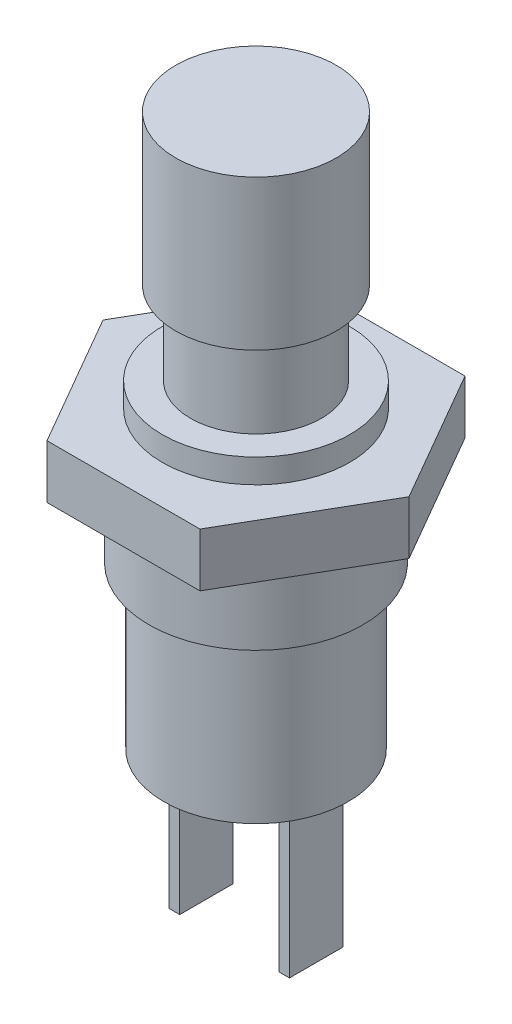
ISO-10303-21;
HEADER;
FILE_DESCRIPTION(('STEP AP214'),'2;1');
FILE_NAME('part.step','',(''),(''),'','','');
FILE_SCHEMA(('AUTOMOTIVE_DESIGN { 1 0 10303 214 1 1 1 1 }'));
ENDSEC;
DATA;
#1=APPLICATION_CONTEXT('core data for automotive mechanical design processes');
#2=APPLICATION_PROTOCOL_DEFINITION('international standard','automotive_design',2000,#1);
#3=PRODUCT_CONTEXT('',#1,'mechanical');
#4=PRODUCT('Part','Part','',(#3));
#5=PRODUCT_RELATED_PRODUCT_CATEGORY('part','',(#4));
#6=PRODUCT_DEFINITION_FORMATION('','',#4);
#7=PRODUCT_DEFINITION_CONTEXT('part definition',#1,'design');
#8=PRODUCT_DEFINITION('design','',#6,#7);
#9=PRODUCT_DEFINITION_SHAPE('','',#8);
#10=(LENGTH_UNIT() NAMED_UNIT(*) SI_UNIT(.MILLI.,.METRE.));
#11=(NAMED_UNIT(*) PLANE_ANGLE_UNIT() SI_UNIT($,.RADIAN.));
#12=(NAMED_UNIT(*) SI_UNIT($,.STERADIAN.) SOLID_ANGLE_UNIT());
#13=UNCERTAINTY_MEASURE_WITH_UNIT(LENGTH_MEASURE(1.E-05),#10,'distance_accuracy_value','');
#14=(GEOMETRIC_REPRESENTATION_CONTEXT(3) GLOBAL_UNCERTAINTY_ASSIGNED_CONTEXT((#13)) GLOBAL_UNIT_ASSIGNED_CONTEXT((#10,
#11,#12)) REPRESENTATION_CONTEXT('',''));
#15=CARTESIAN_POINT('',(0.,0.,0.));
#16=DIRECTION('',(0.,0.,1.));
#17=DIRECTION('',(1.,0.,0.));
#18=AXIS2_PLACEMENT_3D('',#15,#16,#17);
#19=CARTESIAN_POINT('',(3.44470505296126,0.,0.));
#20=DIRECTION('',(0.,1.,0.));
#21=DIRECTION('',(0.,0.,1.));
#22=AXIS2_PLACEMENT_3D('',#19,#20,#21);
#23=PLANE('',#22);
#24=DIRECTION('',(0.,0.,1.));
#25=VECTOR('',#24,1.);
#26=CARTESIAN_POINT('',(-1.85,0.,-1.));
#27=LINE('',#26,#25);
#28=CARTESIAN_POINT('',(-1.85,0.,-1.));
#29=VERTEX_POINT('',#28);
#30=CARTESIAN_POINT('',(-1.85,0.,0.999999999999998));
#31=VERTEX_POINT('',#30);
#32=EDGE_CURVE('E155',#29,#31,#27,.T.);
#33=ORIENTED_EDGE('',*,*,#32,.F.);
#34=DIRECTION('',(1.,0.,0.));
#35=VECTOR('',#34,1.);
#36=CARTESIAN_POINT('',(-2.25,0.,-1.));
#37=LINE('',#36,#35);
#38=CARTESIAN_POINT('',(-2.25,0.,-1.));
#39=VERTEX_POINT('',#38);
#40=EDGE_CURVE('E168',#39,#29,#37,.T.);
#41=ORIENTED_EDGE('',*,*,#40,.F.);
#42=DIRECTION('',(0.,0.,-1.));
#43=VECTOR('',#42,1.);
#44=CARTESIAN_POINT('',(-2.25,0.,-1.));
#45=LINE('',#44,#43);
#46=CARTESIAN_POINT('',(-2.25,0.,0.999999999999998));
#47=VERTEX_POINT('',#46);
#48=EDGE_CURVE('E177',#47,#39,#45,.T.);
#49=ORIENTED_EDGE('',*,*,#48,.F.);
#50=DIRECTION('',(-1.,0.,0.));
#51=VECTOR('',#50,1.);
#52=CARTESIAN_POINT('',(-2.25,0.,0.999999999999998));
#53=LINE('',#52,#51);
#54=EDGE_CURVE('E158',#31,#47,#53,.T.);
#55=ORIENTED_EDGE('',*,*,#54,.F.);
#56=EDGE_LOOP('',(#33,#41,#49,#55));
#57=FACE_BOUND('',#56,.T.);
#58=CARTESIAN_POINT('',(0.,0.,0.));
#59=DIRECTION('',(0.,1.,0.));
#60=DIRECTION('',(0.,0.,1.));
#61=AXIS2_PLACEMENT_3D('',#58,#59,#60);
#62=CIRCLE('',#61,3.44470505296126);
#63=CARTESIAN_POINT('',(0.,0.,3.44470505296126));
#64=VERTEX_POINT('',#63);
#65=EDGE_CURVE('E214',#64,#64,#62,.T.);
#66=ORIENTED_EDGE('',*,*,#65,.F.);
#67=EDGE_LOOP('',(#66));
#68=FACE_BOUND('',#67,.T.);
#69=DIRECTION('',(0.,0.,1.));
#70=VECTOR('',#69,1.);
#71=CARTESIAN_POINT('',(2.25,0.,-1.));
#72=LINE('',#71,#70);
#73=CARTESIAN_POINT('',(2.25,0.,-1.));
#74=VERTEX_POINT('',#73);
#75=CARTESIAN_POINT('',(2.25,0.,1.));
#76=VERTEX_POINT('',#75);
#77=EDGE_CURVE('E154',#74,#76,#72,.T.);
#78=ORIENTED_EDGE('',*,*,#77,.F.);
#79=DIRECTION('',(1.,0.,0.));
#80=VECTOR('',#79,1.);
#81=CARTESIAN_POINT('',(1.85,0.,-1.));
#82=LINE('',#81,#80);
#83=CARTESIAN_POINT('',(1.85,0.,-1.));
#84=VERTEX_POINT('',#83);
#85=EDGE_CURVE('E151',#84,#74,#82,.T.);
#86=ORIENTED_EDGE('',*,*,#85,.F.);
#87=DIRECTION('',(0.,0.,-1.));
#88=VECTOR('',#87,1.);
#89=CARTESIAN_POINT('',(1.85,0.,-1.));
#90=LINE('',#89,#88);
#91=CARTESIAN_POINT('',(1.85,0.,1.));
#92=VERTEX_POINT('',#91);
#93=EDGE_CURVE('E53',#92,#84,#90,.T.);
#94=ORIENTED_EDGE('',*,*,#93,.F.);
#95=DIRECTION('',(-1.,0.,0.));
#96=VECTOR('',#95,1.);
#97=CARTESIAN_POINT('',(1.85,0.,1.));
#98=LINE('',#97,#96);
#99=EDGE_CURVE('E48',#76,#92,#98,.T.);
#100=ORIENTED_EDGE('',*,*,#99,.F.);
#101=EDGE_LOOP('',(#78,#86,#94,#100));
#102=FACE_BOUND('',#101,.T.);
#103=ADVANCED_FACE('F33',(#57,#68,#102),#23,.F.);
#104=CARTESIAN_POINT('',(3.5,11.,0.));
#105=DIRECTION('',(0.,-1.,0.));
#106=DIRECTION('',(0.,0.,-1.));
#107=AXIS2_PLACEMENT_3D('',#104,#105,#106);
#108=PLANE('',#107);
#109=CARTESIAN_POINT('',(0.,11.,0.));
#110=DIRECTION('',(0.,1.,0.));
#111=DIRECTION('',(0.,0.,1.));
#112=AXIS2_PLACEMENT_3D('',#109,#110,#111);
#113=CIRCLE('',#112,3.5);
#114=CARTESIAN_POINT('',(0.,11.,3.5));
#115=VERTEX_POINT('',#114);
#116=EDGE_CURVE('E236',#115,#115,#113,.T.);
#117=ORIENTED_EDGE('',*,*,#116,.F.);
#118=EDGE_LOOP('',(#117));
#119=FACE_BOUND('',#118,.T.);
#120=DIRECTION('',(0.499999999999995,0.,-0.866025403784442));
#121=VECTOR('',#120,1.);
#122=CARTESIAN_POINT('',(2.85750000000006,11.,4.94933518262803));
#123=LINE('',#122,#121);
#124=CARTESIAN_POINT('',(2.85750000000006,11.,4.94933518262803));
#125=VERTEX_POINT('',#124);
#126=CARTESIAN_POINT('',(5.715,11.,0.));
#127=VERTEX_POINT('',#126);
#128=EDGE_CURVE('E193',#125,#127,#123,.T.);
#129=ORIENTED_EDGE('',*,*,#128,.T.);
#130=DIRECTION('',(-0.500000000000001,0.,-0.866025403784438));
#131=VECTOR('',#130,1.);
#132=CARTESIAN_POINT('',(5.715,11.,0.));
#133=LINE('',#132,#131);
#134=CARTESIAN_POINT('',(2.85749999999999,11.,-4.94933518262807));
#135=VERTEX_POINT('',#134);
#136=EDGE_CURVE('E196',#127,#135,#133,.T.);
#137=ORIENTED_EDGE('',*,*,#136,.T.);
#138=DIRECTION('',(-1.,0.,0.));
#139=VECTOR('',#138,1.);
#140=CARTESIAN_POINT('',(2.85749999999999,11.,-4.94933518262807));
#141=LINE('',#140,#139);
#142=CARTESIAN_POINT('',(-2.85750000000002,11.,-4.94933518262805));
#143=VERTEX_POINT('',#142);
#144=EDGE_CURVE('E199',#135,#143,#141,.T.);
#145=ORIENTED_EDGE('',*,*,#144,.T.);
#146=DIRECTION('',(-0.499999999999995,0.,0.866025403784441));
#147=VECTOR('',#146,1.);
#148=CARTESIAN_POINT('',(-2.85750000000002,11.,-4.94933518262805));
#149=LINE('',#148,#147);
#150=CARTESIAN_POINT('',(-5.715,11.,0.));
#151=VERTEX_POINT('',#150);
#152=EDGE_CURVE('E202',#143,#151,#149,.T.);
#153=ORIENTED_EDGE('',*,*,#152,.T.);
#154=DIRECTION('',(0.500000000000007,0.,0.866025403784434));
#155=VECTOR('',#154,1.);
#156=CARTESIAN_POINT('',(-5.715,11.,0.));
#157=LINE('',#156,#155);
#158=CARTESIAN_POINT('',(-2.85749999999995,11.,4.94933518262809));
#159=VERTEX_POINT('',#158);
#160=EDGE_CURVE('E205',#151,#159,#157,.T.);
#161=ORIENTED_EDGE('',*,*,#160,.T.);
#162=DIRECTION('',(1.,0.,0.));
#163=VECTOR('',#162,1.);
#164=CARTESIAN_POINT('',(-2.85749999999995,11.,4.94933518262809));
#165=LINE('',#164,#163);
#166=EDGE_CURVE('E208',#159,#125,#165,.T.);
#167=ORIENTED_EDGE('',*,*,#166,.T.);
#168=EDGE_LOOP('',(#129,#137,#145,#153,#161,#167));
#169=FACE_BOUND('',#168,.T.);
#170=ADVANCED_FACE('F286',(#119,#169),#108,.F.);
#171=CARTESIAN_POINT('',(0.,20.6,0.));
#172=DIRECTION('',(0.,-1.,0.));
#173=DIRECTION('',(0.,0.,-1.));
#174=AXIS2_PLACEMENT_3D('',#171,#172,#173);
#175=PLANE('',#174);
#176=CARTESIAN_POINT('',(0.,20.6,0.));
#177=DIRECTION('',(0.,1.,0.));
#178=DIRECTION('',(0.,0.,1.));
#179=AXIS2_PLACEMENT_3D('',#176,#177,#178);
#180=CIRCLE('',#179,3.);
#181=CARTESIAN_POINT('',(0.,20.6,3.));
#182=VERTEX_POINT('',#181);
#183=EDGE_CURVE('E251',#182,#182,#180,.T.);
#184=ORIENTED_EDGE('',*,*,#183,.T.);
#185=EDGE_LOOP('',(#184));
#186=FACE_BOUND('',#185,.T.);
#187=ADVANCED_FACE('F35',(#186),#175,.F.);
#188=CARTESIAN_POINT('',(0.,22.7269669544607,0.));
#189=DIRECTION('',(0.,1.,0.));
#190=DIRECTION('',(0.,0.,1.));
#191=AXIS2_PLACEMENT_3D('',#188,#189,#190);
#192=CYLINDRICAL_SURFACE('',#191,3.);
#193=ORIENTED_EDGE('',*,*,#183,.F.);
#194=EDGE_LOOP('',(#193));
#195=FACE_BOUND('',#194,.T.);
#196=CARTESIAN_POINT('',(0.,15.,0.));
#197=DIRECTION('',(0.,1.,0.));
#198=DIRECTION('',(0.,0.,1.));
#199=AXIS2_PLACEMENT_3D('',#196,#197,#198);
#200=CIRCLE('',#199,3.);
#201=CARTESIAN_POINT('',(0.,15.,3.));
#202=VERTEX_POINT('',#201);
#203=EDGE_CURVE('E248',#202,#202,#200,.T.);
#204=ORIENTED_EDGE('',*,*,#203,.T.);
#205=EDGE_LOOP('',(#204));
#206=FACE_BOUND('',#205,.T.);
#207=ADVANCED_FACE('F345',(#195,#206),#192,.T.);
#208=CARTESIAN_POINT('',(3.,15.,0.));
#209=DIRECTION('',(0.,1.,0.));
#210=DIRECTION('',(0.,0.,1.));
#211=AXIS2_PLACEMENT_3D('',#208,#209,#210);
#212=PLANE('',#211);
#213=ORIENTED_EDGE('',*,*,#203,.F.);
#214=EDGE_LOOP('',(#213));
#215=FACE_BOUND('',#214,.T.);
#216=CARTESIAN_POINT('',(0.,15.,0.));
#217=DIRECTION('',(0.,1.,0.));
#218=DIRECTION('',(0.,0.,1.));
#219=AXIS2_PLACEMENT_3D('',#216,#217,#218);
#220=CIRCLE('',#219,2.44643968431836);
#221=CARTESIAN_POINT('',(0.,15.,2.44643968431836));
#222=VERTEX_POINT('',#221);
#223=EDGE_CURVE('E245',#222,#222,#220,.T.);
#224=ORIENTED_EDGE('',*,*,#223,.T.);
#225=EDGE_LOOP('',(#224));
#226=FACE_BOUND('',#225,.T.);
#227=ADVANCED_FACE('F342',(#215,#226),#212,.F.);
#228=CARTESIAN_POINT('',(0.,22.7269669544607,0.));
#229=DIRECTION('',(0.,1.,0.));
#230=DIRECTION('',(0.,0.,1.));
#231=AXIS2_PLACEMENT_3D('',#228,#229,#230);
#232=CYLINDRICAL_SURFACE('',#231,2.44643968431836);
#233=ORIENTED_EDGE('',*,*,#223,.F.);
#234=EDGE_LOOP('',(#233));
#235=FACE_BOUND('',#234,.T.);
#236=CARTESIAN_POINT('',(0.,11.9,0.));
#237=DIRECTION('',(0.,1.,0.));
#238=DIRECTION('',(0.,0.,1.));
#239=AXIS2_PLACEMENT_3D('',#236,#237,#238);
#240=CIRCLE('',#239,2.44643968431836);
#241=CARTESIAN_POINT('',(0.,11.9,2.44643968431836));
#242=VERTEX_POINT('',#241);
#243=EDGE_CURVE('E242',#242,#242,#240,.T.);
#244=ORIENTED_EDGE('',*,*,#243,.T.);
#245=EDGE_LOOP('',(#244));
#246=FACE_BOUND('',#245,.T.);
#247=ADVANCED_FACE('F338',(#235,#246),#232,.T.);
#248=CARTESIAN_POINT('',(2.44643968431836,11.9,0.));
#249=DIRECTION('',(0.,-1.,0.));
#250=DIRECTION('',(0.,0.,-1.));
#251=AXIS2_PLACEMENT_3D('',#248,#249,#250);
#252=PLANE('',#251);
#253=ORIENTED_EDGE('',*,*,#243,.F.);
#254=EDGE_LOOP('',(#253));
#255=FACE_BOUND('',#254,.T.);
#256=CARTESIAN_POINT('',(0.,11.9,0.));
#257=DIRECTION('',(0.,1.,0.));
#258=DIRECTION('',(0.,0.,1.));
#259=AXIS2_PLACEMENT_3D('',#256,#257,#258);
#260=CIRCLE('',#259,3.5);
#261=CARTESIAN_POINT('',(0.,11.9,3.5));
#262=VERTEX_POINT('',#261);
#263=EDGE_CURVE('E239',#262,#262,#260,.T.);
#264=ORIENTED_EDGE('',*,*,#263,.T.);
#265=EDGE_LOOP('',(#264));
#266=FACE_BOUND('',#265,.T.);
#267=ADVANCED_FACE('F334',(#255,#266),#252,.F.);
#268=CARTESIAN_POINT('',(0.,22.7269669544607,0.));
#269=DIRECTION('',(0.,1.,0.));
#270=DIRECTION('',(0.,0.,1.));
#271=AXIS2_PLACEMENT_3D('',#268,#269,#270);
#272=CYLINDRICAL_SURFACE('',#271,3.5);
#273=ORIENTED_EDGE('',*,*,#263,.F.);
#274=EDGE_LOOP('',(#273));
#275=FACE_BOUND('',#274,.T.);
#276=ORIENTED_EDGE('',*,*,#116,.T.);
#277=EDGE_LOOP('',(#276));
#278=FACE_BOUND('',#277,.T.);
#279=ADVANCED_FACE('F331',(#275,#278),#272,.T.);
#280=CARTESIAN_POINT('',(2.85750000000006,6.,4.94933518262803));
#281=DIRECTION('',(0.866025403784442,0.,0.499999999999995));
#282=DIRECTION('',(0.499999999999995,0.,-0.866025403784442));
#283=AXIS2_PLACEMENT_3D('',#280,#281,#282);
#284=PLANE('',#283);
#285=DIRECTION('',(0.499999999999995,0.,-0.866025403784442));
#286=VECTOR('',#285,1.);
#287=CARTESIAN_POINT('',(5.715,9.,0.));
#288=LINE('',#287,#286);
#289=CARTESIAN_POINT('',(2.85750000000006,9.,4.94933518262803));
#290=VERTEX_POINT('',#289);
#291=CARTESIAN_POINT('',(5.715,9.,0.));
#292=VERTEX_POINT('',#291);
#293=EDGE_CURVE('E11',#290,#292,#288,.T.);
#294=ORIENTED_EDGE('',*,*,#293,.T.);
#295=DIRECTION('',(0.,1.,0.));
#296=VECTOR('',#295,1.);
#297=CARTESIAN_POINT('',(5.715,6.,0.));
#298=LINE('',#297,#296);
#299=EDGE_CURVE('E211',#292,#127,#298,.T.);
#300=ORIENTED_EDGE('',*,*,#299,.T.);
#301=ORIENTED_EDGE('',*,*,#128,.F.);
#302=DIRECTION('',(0.,1.,0.));
#303=VECTOR('',#302,1.);
#304=CARTESIAN_POINT('',(2.85750000000006,6.,4.94933518262803));
#305=LINE('',#304,#303);
#306=EDGE_CURVE('E212',#290,#125,#305,.T.);
#307=ORIENTED_EDGE('',*,*,#306,.F.);
#308=EDGE_LOOP('',(#294,#300,#301,#307));
#309=FACE_BOUND('',#308,.T.);
#310=ADVANCED_FACE('F272',(#309),#284,.T.);
#311=CARTESIAN_POINT('',(-2.85749999999995,6.,4.94933518262809));
#312=DIRECTION('',(0.,0.,1.));
#313=DIRECTION('',(1.,0.,0.));
#314=AXIS2_PLACEMENT_3D('',#311,#312,#313);
#315=PLANE('',#314);
#316=DIRECTION('',(1.,0.,0.));
#317=VECTOR('',#316,1.);
#318=CARTESIAN_POINT('',(5.71500000000005,9.,4.94933518262801));
#319=LINE('',#318,#317);
#320=CARTESIAN_POINT('',(-2.85749999999995,9.,4.94933518262809));
#321=VERTEX_POINT('',#320);
#322=EDGE_CURVE('E41',#321,#290,#319,.T.);
#323=ORIENTED_EDGE('',*,*,#322,.T.);
#324=ORIENTED_EDGE('',*,*,#306,.T.);
#325=ORIENTED_EDGE('',*,*,#166,.F.);
#326=DIRECTION('',(0.,1.,0.));
#327=VECTOR('',#326,1.);
#328=CARTESIAN_POINT('',(-2.85749999999995,6.,4.94933518262809));
#329=LINE('',#328,#327);
#330=EDGE_CURVE('E215',#321,#159,#329,.T.);
#331=ORIENTED_EDGE('',*,*,#330,.F.);
#332=EDGE_LOOP('',(#323,#324,#325,#331));
#333=FACE_BOUND('',#332,.T.);
#334=ADVANCED_FACE('F265',(#333),#315,.T.);
#335=CARTESIAN_POINT('',(-5.715,6.,0.));
#336=DIRECTION('',(-0.866025403784435,0.,0.500000000000007));
#337=DIRECTION('',(0.500000000000007,0.,0.866025403784435));
#338=AXIS2_PLACEMENT_3D('',#335,#336,#337);
#339=PLANE('',#338);
#340=DIRECTION('',(0.500000000000007,0.,0.866025403784435));
#341=VECTOR('',#340,1.);
#342=CARTESIAN_POINT('',(-2.85749999999994,9.,4.94933518262813));
#343=LINE('',#342,#341);
#344=CARTESIAN_POINT('',(-5.715,9.,0.));
#345=VERTEX_POINT('',#344);
#346=EDGE_CURVE('E260',#345,#321,#343,.T.);
#347=ORIENTED_EDGE('',*,*,#346,.T.);
#348=ORIENTED_EDGE('',*,*,#330,.T.);
#349=ORIENTED_EDGE('',*,*,#160,.F.);
#350=DIRECTION('',(0.,1.,0.));
#351=VECTOR('',#350,1.);
#352=CARTESIAN_POINT('',(-5.715,6.,0.));
#353=LINE('',#352,#351);
#354=EDGE_CURVE('E217',#345,#151,#353,.T.);
#355=ORIENTED_EDGE('',*,*,#354,.F.);
#356=EDGE_LOOP('',(#347,#348,#349,#355));
#357=FACE_BOUND('',#356,.T.);
#358=ADVANCED_FACE('F290',(#357),#339,.T.);
#359=CARTESIAN_POINT('',(-2.85750000000002,6.,-4.94933518262805));
#360=DIRECTION('',(-0.866025403784442,0.,-0.499999999999995));
#361=DIRECTION('',(-0.499999999999995,0.,0.866025403784442));
#362=AXIS2_PLACEMENT_3D('',#359,#360,#361);
#363=PLANE('',#362);
#364=DIRECTION('',(-0.499999999999995,0.,0.866025403784442));
#365=VECTOR('',#364,1.);
#366=CARTESIAN_POINT('',(-2.85750000000004,9.,-4.94933518262803));
#367=LINE('',#366,#365);
#368=CARTESIAN_POINT('',(-2.85750000000002,9.,-4.94933518262805));
#369=VERTEX_POINT('',#368);
#370=EDGE_CURVE('E258',#369,#345,#367,.T.);
#371=ORIENTED_EDGE('',*,*,#370,.T.);
#372=ORIENTED_EDGE('',*,*,#354,.T.);
#373=ORIENTED_EDGE('',*,*,#152,.F.);
#374=DIRECTION('',(0.,1.,0.));
#375=VECTOR('',#374,1.);
#376=CARTESIAN_POINT('',(-2.85750000000002,6.,-4.94933518262805));
#377=LINE('',#376,#375);
#378=EDGE_CURVE('E219',#369,#143,#377,.T.);
#379=ORIENTED_EDGE('',*,*,#378,.F.);
#380=EDGE_LOOP('',(#371,#372,#373,#379));
#381=FACE_BOUND('',#380,.T.);
#382=ADVANCED_FACE('F292',(#381),#363,.T.);
#383=CARTESIAN_POINT('',(2.85749999999999,6.,-4.94933518262807));
#384=DIRECTION('',(0.,0.,-1.));
#385=DIRECTION('',(-1.,0.,0.));
#386=AXIS2_PLACEMENT_3D('',#383,#384,#385);
#387=PLANE('',#386);
#388=DIRECTION('',(-1.,0.,0.));
#389=VECTOR('',#388,1.);
#390=CARTESIAN_POINT('',(5.71499999999998,9.,-4.94933518262809));
#391=LINE('',#390,#389);
#392=CARTESIAN_POINT('',(2.85749999999999,9.,-4.94933518262807));
#393=VERTEX_POINT('',#392);
#394=EDGE_CURVE('E256',#393,#369,#391,.T.);
#395=ORIENTED_EDGE('',*,*,#394,.T.);
#396=ORIENTED_EDGE('',*,*,#378,.T.);
#397=ORIENTED_EDGE('',*,*,#144,.F.);
#398=DIRECTION('',(0.,1.,0.));
#399=VECTOR('',#398,1.);
#400=CARTESIAN_POINT('',(2.85749999999999,6.,-4.94933518262807));
#401=LINE('',#400,#399);
#402=EDGE_CURVE('E221',#393,#135,#401,.T.);
#403=ORIENTED_EDGE('',*,*,#402,.F.);
#404=EDGE_LOOP('',(#395,#396,#397,#403));
#405=FACE_BOUND('',#404,.T.);
#406=ADVANCED_FACE('F282',(#405),#387,.T.);
#407=CARTESIAN_POINT('',(5.715,6.,0.));
#408=DIRECTION('',(0.866025403784438,0.,-0.500000000000001));
#409=DIRECTION('',(-0.500000000000001,0.,-0.866025403784438));
#410=AXIS2_PLACEMENT_3D('',#407,#408,#409);
#411=PLANE('',#410);
#412=DIRECTION('',(-0.500000000000001,0.,-0.866025403784438));
#413=VECTOR('',#412,1.);
#414=CARTESIAN_POINT('',(5.715,9.,0.));
#415=LINE('',#414,#413);
#416=EDGE_CURVE('E254',#292,#393,#415,.T.);
#417=ORIENTED_EDGE('',*,*,#416,.T.);
#418=ORIENTED_EDGE('',*,*,#402,.T.);
#419=ORIENTED_EDGE('',*,*,#136,.F.);
#420=ORIENTED_EDGE('',*,*,#299,.F.);
#421=EDGE_LOOP('',(#417,#418,#419,#420));
#422=FACE_BOUND('',#421,.T.);
#423=ADVANCED_FACE('F279',(#422),#411,.T.);
#424=CARTESIAN_POINT('',(0.,22.7269669544607,0.));
#425=DIRECTION('',(0.,1.,0.));
#426=DIRECTION('',(0.,0.,1.));
#427=AXIS2_PLACEMENT_3D('',#424,#425,#426);
#428=CYLINDRICAL_SURFACE('',#427,3.44470505296126);
#429=CARTESIAN_POINT('',(0.,6.,0.));
#430=DIRECTION('',(0.,1.,0.));
#431=DIRECTION('',(0.,0.,1.));
#432=AXIS2_PLACEMENT_3D('',#429,#430,#431);
#433=CIRCLE('',#432,3.44470505296126);
#434=CARTESIAN_POINT('',(0.,6.,3.44470505296126));
#435=VERTEX_POINT('',#434);
#436=EDGE_CURVE('E227',#435,#435,#433,.T.);
#437=ORIENTED_EDGE('',*,*,#436,.F.);
#438=EDGE_LOOP('',(#437));
#439=FACE_BOUND('',#438,.T.);
#440=ORIENTED_EDGE('',*,*,#65,.T.);
#441=EDGE_LOOP('',(#440));
#442=FACE_BOUND('',#441,.T.);
#443=ADVANCED_FACE('F315',(#439,#442),#428,.T.);
#444=CARTESIAN_POINT('',(4.,6.,0.));
#445=DIRECTION('',(0.,1.,0.));
#446=DIRECTION('',(0.,0.,1.));
#447=AXIS2_PLACEMENT_3D('',#444,#445,#446);
#448=PLANE('',#447);
#449=CARTESIAN_POINT('',(0.,6.,0.));
#450=DIRECTION('',(0.,1.,0.));
#451=DIRECTION('',(0.,0.,1.));
#452=AXIS2_PLACEMENT_3D('',#449,#450,#451);
#453=CIRCLE('',#452,4.);
#454=CARTESIAN_POINT('',(0.,6.,4.));
#455=VERTEX_POINT('',#454);
#456=EDGE_CURVE('E230',#455,#455,#453,.T.);
#457=ORIENTED_EDGE('',*,*,#456,.F.);
#458=EDGE_LOOP('',(#457));
#459=FACE_BOUND('',#458,.T.);
#460=ORIENTED_EDGE('',*,*,#436,.T.);
#461=EDGE_LOOP('',(#460));
#462=FACE_BOUND('',#461,.T.);
#463=ADVANCED_FACE('F318',(#459,#462),#448,.F.);
#464=CARTESIAN_POINT('',(0.,22.7269669544607,0.));
#465=DIRECTION('',(0.,1.,0.));
#466=DIRECTION('',(0.,0.,1.));
#467=AXIS2_PLACEMENT_3D('',#464,#465,#466);
#468=CYLINDRICAL_SURFACE('',#467,4.);
#469=CARTESIAN_POINT('',(0.,9.,0.));
#470=DIRECTION('',(0.,1.,0.));
#471=DIRECTION('',(0.,0.,1.));
#472=AXIS2_PLACEMENT_3D('',#469,#470,#471);
#473=CIRCLE('',#472,4.);
#474=CARTESIAN_POINT('',(0.,9.,4.));
#475=VERTEX_POINT('',#474);
#476=EDGE_CURVE('E233',#475,#475,#473,.T.);
#477=ORIENTED_EDGE('',*,*,#476,.F.);
#478=EDGE_LOOP('',(#477));
#479=FACE_BOUND('',#478,.T.);
#480=ORIENTED_EDGE('',*,*,#456,.T.);
#481=EDGE_LOOP('',(#480));
#482=FACE_BOUND('',#481,.T.);
#483=ADVANCED_FACE('F322',(#479,#482),#468,.T.);
#484=CARTESIAN_POINT('',(5.715,9.,0.));
#485=DIRECTION('',(0.,1.,0.));
#486=DIRECTION('',(0.,0.,1.));
#487=AXIS2_PLACEMENT_3D('',#484,#485,#486);
#488=PLANE('',#487);
#489=ORIENTED_EDGE('',*,*,#476,.T.);
#490=EDGE_LOOP('',(#489));
#491=FACE_BOUND('',#490,.T.);
#492=ORIENTED_EDGE('',*,*,#293,.F.);
#493=ORIENTED_EDGE('',*,*,#322,.F.);
#494=ORIENTED_EDGE('',*,*,#346,.F.);
#495=ORIENTED_EDGE('',*,*,#370,.F.);
#496=ORIENTED_EDGE('',*,*,#394,.F.);
#497=ORIENTED_EDGE('',*,*,#416,.F.);
#498=EDGE_LOOP('',(#492,#493,#494,#495,#496,#497));
#499=FACE_BOUND('',#498,.T.);
#500=ADVANCED_FACE('F274',(#491,#499),#488,.F.);
#501=CARTESIAN_POINT('',(-1.85,-5.8,-1.));
#502=DIRECTION('',(-1.,0.,0.));
#503=DIRECTION('',(0.,0.,1.));
#504=AXIS2_PLACEMENT_3D('',#501,#502,#503);
#505=PLANE('',#504);
#506=ORIENTED_EDGE('',*,*,#32,.T.);
#507=DIRECTION('',(0.,1.,0.));
#508=VECTOR('',#507,1.);
#509=CARTESIAN_POINT('',(-1.85,-5.8,0.999999999999998));
#510=LINE('',#509,#508);
#511=CARTESIAN_POINT('',(-1.85,-5.8,0.999999999999998));
#512=VERTEX_POINT('',#511);
#513=EDGE_CURVE('E190',#512,#31,#510,.T.);
#514=ORIENTED_EDGE('',*,*,#513,.F.);
#515=DIRECTION('',(0.,0.,1.));
#516=VECTOR('',#515,1.);
#517=CARTESIAN_POINT('',(-1.85,-5.8,-1.));
#518=LINE('',#517,#516);
#519=CARTESIAN_POINT('',(-1.85,-5.8,-1.));
#520=VERTEX_POINT('',#519);
#521=EDGE_CURVE('E164',#520,#512,#518,.T.);
#522=ORIENTED_EDGE('',*,*,#521,.F.);
#523=DIRECTION('',(0.,1.,0.));
#524=VECTOR('',#523,1.);
#525=CARTESIAN_POINT('',(-1.85,-5.8,-1.));
#526=LINE('',#525,#524);
#527=EDGE_CURVE('E173',#520,#29,#526,.T.);
#528=ORIENTED_EDGE('',*,*,#527,.T.);
#529=EDGE_LOOP('',(#506,#514,#522,#528));
#530=FACE_BOUND('',#529,.T.);
#531=ADVANCED_FACE('F328',(#530),#505,.F.);
#532=CARTESIAN_POINT('',(-2.25,-5.8,0.999999999999998));
#533=DIRECTION('',(0.,0.,-1.));
#534=DIRECTION('',(-1.,0.,0.));
#535=AXIS2_PLACEMENT_3D('',#532,#533,#534);
#536=PLANE('',#535);
#537=ORIENTED_EDGE('',*,*,#54,.T.);
#538=DIRECTION('',(0.,1.,0.));
#539=VECTOR('',#538,1.);
#540=CARTESIAN_POINT('',(-2.25,-5.8,0.999999999999998));
#541=LINE('',#540,#539);
#542=CARTESIAN_POINT('',(-2.25,-5.8,0.999999999999998));
#543=VERTEX_POINT('',#542);
#544=EDGE_CURVE('E187',#543,#47,#541,.T.);
#545=ORIENTED_EDGE('',*,*,#544,.F.);
#546=DIRECTION('',(-1.,0.,0.));
#547=VECTOR('',#546,1.);
#548=CARTESIAN_POINT('',(-2.25,-5.8,0.999999999999998));
#549=LINE('',#548,#547);
#550=EDGE_CURVE('E167',#512,#543,#549,.T.);
#551=ORIENTED_EDGE('',*,*,#550,.F.);
#552=ORIENTED_EDGE('',*,*,#513,.T.);
#553=EDGE_LOOP('',(#537,#545,#551,#552));
#554=FACE_BOUND('',#553,.T.);
#555=ADVANCED_FACE('F431',(#554),#536,.F.);
#556=CARTESIAN_POINT('',(-2.25,-5.8,-1.));
#557=DIRECTION('',(1.,0.,0.));
#558=DIRECTION('',(0.,0.,-1.));
#559=AXIS2_PLACEMENT_3D('',#556,#557,#558);
#560=PLANE('',#559);
#561=ORIENTED_EDGE('',*,*,#48,.T.);
#562=DIRECTION('',(0.,1.,0.));
#563=VECTOR('',#562,1.);
#564=CARTESIAN_POINT('',(-2.25,-5.8,-1.));
#565=LINE('',#564,#563);
#566=CARTESIAN_POINT('',(-2.25,-5.8,-1.));
#567=VERTEX_POINT('',#566);
#568=EDGE_CURVE('E184',#567,#39,#565,.T.);
#569=ORIENTED_EDGE('',*,*,#568,.F.);
#570=DIRECTION('',(0.,0.,-1.));
#571=VECTOR('',#570,1.);
#572=CARTESIAN_POINT('',(-2.25,-5.8,-1.));
#573=LINE('',#572,#571);
#574=EDGE_CURVE('E170',#543,#567,#573,.T.);
#575=ORIENTED_EDGE('',*,*,#574,.F.);
#576=ORIENTED_EDGE('',*,*,#544,.T.);
#577=EDGE_LOOP('',(#561,#569,#575,#576));
#578=FACE_BOUND('',#577,.T.);
#579=ADVANCED_FACE('F438',(#578),#560,.F.);
#580=CARTESIAN_POINT('',(-2.25,-5.8,-1.));
#581=DIRECTION('',(0.,0.,1.));
#582=DIRECTION('',(1.,0.,0.));
#583=AXIS2_PLACEMENT_3D('',#580,#581,#582);
#584=PLANE('',#583);
#585=ORIENTED_EDGE('',*,*,#40,.T.);
#586=ORIENTED_EDGE('',*,*,#527,.F.);
#587=DIRECTION('',(1.,0.,0.));
#588=VECTOR('',#587,1.);
#589=CARTESIAN_POINT('',(-2.25,-5.8,-1.));
#590=LINE('',#589,#588);
#591=EDGE_CURVE('E172',#567,#520,#590,.T.);
#592=ORIENTED_EDGE('',*,*,#591,.F.);
#593=ORIENTED_EDGE('',*,*,#568,.T.);
#594=EDGE_LOOP('',(#585,#586,#592,#593));
#595=FACE_BOUND('',#594,.T.);
#596=ADVANCED_FACE('F446',(#595),#584,.F.);
#597=CARTESIAN_POINT('',(0.,-5.8,0.));
#598=DIRECTION('',(0.,1.,0.));
#599=DIRECTION('',(0.,0.,1.));
#600=AXIS2_PLACEMENT_3D('',#597,#598,#599);
#601=PLANE('',#600);
#602=ORIENTED_EDGE('',*,*,#521,.T.);
#603=ORIENTED_EDGE('',*,*,#550,.T.);
#604=ORIENTED_EDGE('',*,*,#574,.T.);
#605=ORIENTED_EDGE('',*,*,#591,.T.);
#606=EDGE_LOOP('',(#602,#603,#604,#605));
#607=FACE_BOUND('',#606,.T.);
#608=ADVANCED_FACE('F454',(#607),#601,.F.);
#609=CARTESIAN_POINT('',(2.25,-5.8,-1.));
#610=DIRECTION('',(-1.,0.,0.));
#611=DIRECTION('',(0.,0.,1.));
#612=AXIS2_PLACEMENT_3D('',#609,#610,#611);
#613=PLANE('',#612);
#614=ORIENTED_EDGE('',*,*,#77,.T.);
#615=DIRECTION('',(0.,1.,0.));
#616=VECTOR('',#615,1.);
#617=CARTESIAN_POINT('',(2.25,-5.8,1.));
#618=LINE('',#617,#616);
#619=CARTESIAN_POINT('',(2.25,-5.8,1.));
#620=VERTEX_POINT('',#619);
#621=EDGE_CURVE('E135',#620,#76,#618,.T.);
#622=ORIENTED_EDGE('',*,*,#621,.F.);
#623=DIRECTION('',(0.,0.,1.));
#624=VECTOR('',#623,1.);
#625=CARTESIAN_POINT('',(2.25,-5.8,-1.));
#626=LINE('',#625,#624);
#627=CARTESIAN_POINT('',(2.25,-5.8,-1.));
#628=VERTEX_POINT('',#627);
#629=EDGE_CURVE('E142',#628,#620,#626,.T.);
#630=ORIENTED_EDGE('',*,*,#629,.F.);
#631=DIRECTION('',(0.,1.,0.));
#632=VECTOR('',#631,1.);
#633=CARTESIAN_POINT('',(2.25,-5.8,-1.));
#634=LINE('',#633,#632);
#635=EDGE_CURVE('E521',#628,#74,#634,.T.);
#636=ORIENTED_EDGE('',*,*,#635,.T.);
#637=EDGE_LOOP('',(#614,#622,#630,#636));
#638=FACE_BOUND('',#637,.T.);
#639=ADVANCED_FACE('F153',(#638),#613,.F.);
#640=CARTESIAN_POINT('',(1.85,-5.8,1.));
#641=DIRECTION('',(0.,0.,-1.));
#642=DIRECTION('',(-1.,0.,0.));
#643=AXIS2_PLACEMENT_3D('',#640,#641,#642);
#644=PLANE('',#643);
#645=ORIENTED_EDGE('',*,*,#99,.T.);
#646=DIRECTION('',(0.,1.,0.));
#647=VECTOR('',#646,1.);
#648=CARTESIAN_POINT('',(1.85,-5.8,1.));
#649=LINE('',#648,#647);
#650=CARTESIAN_POINT('',(1.85,-5.8,1.));
#651=VERTEX_POINT('',#650);
#652=EDGE_CURVE('E138',#651,#92,#649,.T.);
#653=ORIENTED_EDGE('',*,*,#652,.F.);
#654=DIRECTION('',(-1.,0.,0.));
#655=VECTOR('',#654,1.);
#656=CARTESIAN_POINT('',(1.85,-5.8,1.));
#657=LINE('',#656,#655);
#658=EDGE_CURVE('E131',#620,#651,#657,.T.);
#659=ORIENTED_EDGE('',*,*,#658,.F.);
#660=ORIENTED_EDGE('',*,*,#621,.T.);
#661=EDGE_LOOP('',(#645,#653,#659,#660));
#662=FACE_BOUND('',#661,.T.);
#663=ADVANCED_FACE('F133',(#662),#644,.F.);
#664=CARTESIAN_POINT('',(1.85,-5.8,-1.));
#665=DIRECTION('',(1.,0.,0.));
#666=DIRECTION('',(0.,0.,-1.));
#667=AXIS2_PLACEMENT_3D('',#664,#665,#666);
#668=PLANE('',#667);
#669=ORIENTED_EDGE('',*,*,#93,.T.);
#670=DIRECTION('',(0.,1.,0.));
#671=VECTOR('',#670,1.);
#672=CARTESIAN_POINT('',(1.85,-5.8,-1.));
#673=LINE('',#672,#671);
#674=CARTESIAN_POINT('',(1.85,-5.8,-1.));
#675=VERTEX_POINT('',#674);
#676=EDGE_CURVE('E160',#675,#84,#673,.T.);
#677=ORIENTED_EDGE('',*,*,#676,.F.);
#678=DIRECTION('',(0.,0.,-1.));
#679=VECTOR('',#678,1.);
#680=CARTESIAN_POINT('',(1.85,-5.8,-1.));
#681=LINE('',#680,#679);
#682=EDGE_CURVE('E141',#651,#675,#681,.T.);
#683=ORIENTED_EDGE('',*,*,#682,.F.);
#684=ORIENTED_EDGE('',*,*,#652,.T.);
#685=EDGE_LOOP('',(#669,#677,#683,#684));
#686=FACE_BOUND('',#685,.T.);
#687=ADVANCED_FACE('F475',(#686),#668,.F.);
#688=CARTESIAN_POINT('',(1.85,-5.8,-1.));
#689=DIRECTION('',(0.,0.,1.));
#690=DIRECTION('',(1.,0.,0.));
#691=AXIS2_PLACEMENT_3D('',#688,#689,#690);
#692=PLANE('',#691);
#693=ORIENTED_EDGE('',*,*,#85,.T.);
#694=ORIENTED_EDGE('',*,*,#635,.F.);
#695=DIRECTION('',(1.,0.,0.));
#696=VECTOR('',#695,1.);
#697=CARTESIAN_POINT('',(1.85,-5.8,-1.));
#698=LINE('',#697,#696);
#699=EDGE_CURVE('E147',#675,#628,#698,.T.);
#700=ORIENTED_EDGE('',*,*,#699,.F.);
#701=ORIENTED_EDGE('',*,*,#676,.T.);
#702=EDGE_LOOP('',(#693,#694,#700,#701));
#703=FACE_BOUND('',#702,.T.);
#704=ADVANCED_FACE('F482',(#703),#692,.F.);
#705=CARTESIAN_POINT('',(0.,-5.8,0.));
#706=DIRECTION('',(0.,1.,0.));
#707=DIRECTION('',(0.,0.,1.));
#708=AXIS2_PLACEMENT_3D('',#705,#706,#707);
#709=PLANE('',#708);
#710=ORIENTED_EDGE('',*,*,#629,.T.);
#711=ORIENTED_EDGE('',*,*,#658,.T.);
#712=ORIENTED_EDGE('',*,*,#682,.T.);
#713=ORIENTED_EDGE('',*,*,#699,.T.);
#714=EDGE_LOOP('',(#710,#711,#712,#713));
#715=FACE_BOUND('',#714,.T.);
#716=ADVANCED_FACE('F145',(#715),#709,.F.);
#717=CLOSED_SHELL('',(#103,#170,#187,#207,#227,#247,#267,#279,#310,#334,#358,#382,#406,#423,
#443,#463,#483,#500,#531,#555,#579,#596,#608,#639,#663,#687,#704,#716));
#718=MANIFOLD_SOLID_BREP('B2',#717);
#719=ADVANCED_BREP_SHAPE_REPRESENTATION('',(#18,#718),#14);
#720=SHAPE_DEFINITION_REPRESENTATION(#9,#719);
ENDSEC;
END-ISO-10303-21;
